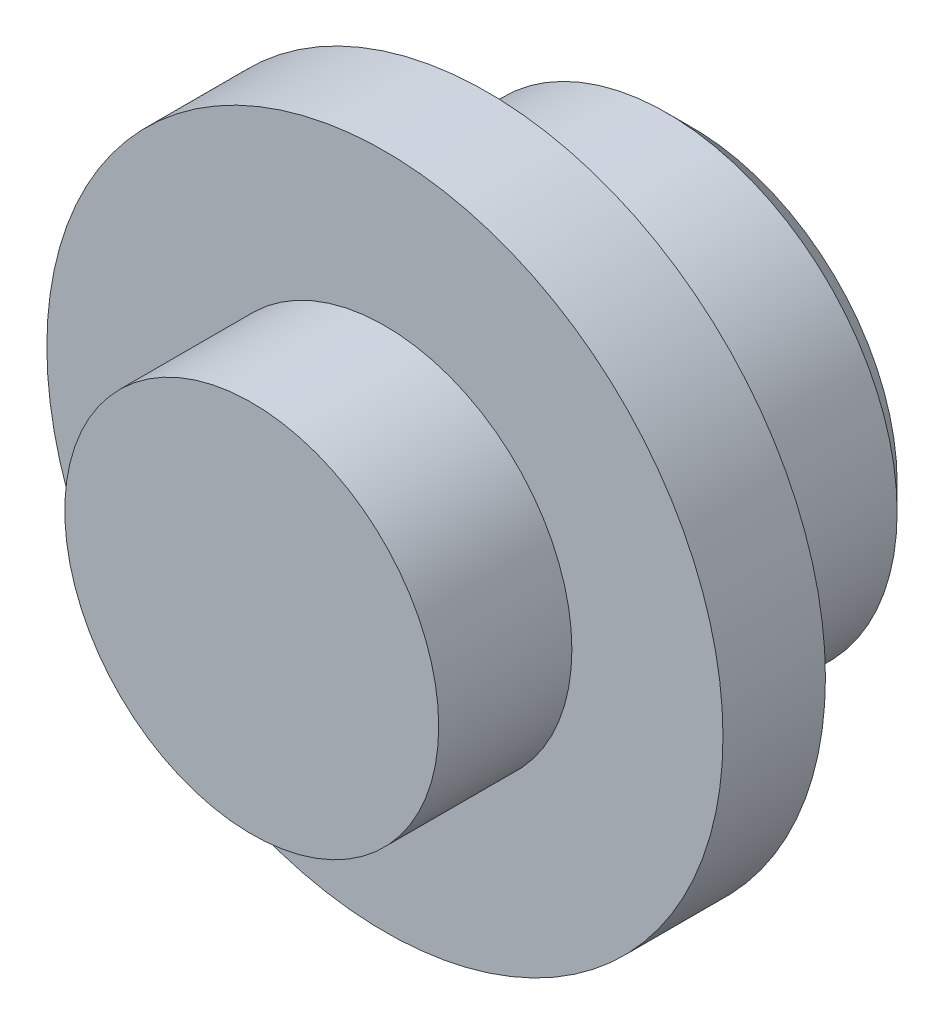
ISO-10303-21;
HEADER;
FILE_DESCRIPTION(('STEP AP214'),'2;1');
FILE_NAME('part.step','',(''),(''),'','','');
FILE_SCHEMA(('AUTOMOTIVE_DESIGN { 1 0 10303 214 1 1 1 1 }'));
ENDSEC;
DATA;
#1=APPLICATION_CONTEXT('core data for automotive mechanical design processes');
#2=APPLICATION_PROTOCOL_DEFINITION('international standard','automotive_design',2000,#1);
#3=PRODUCT_CONTEXT('',#1,'mechanical');
#4=PRODUCT('Part','Part','',(#3));
#5=PRODUCT_RELATED_PRODUCT_CATEGORY('part','',(#4));
#6=PRODUCT_DEFINITION_FORMATION('','',#4);
#7=PRODUCT_DEFINITION_CONTEXT('part definition',#1,'design');
#8=PRODUCT_DEFINITION('design','',#6,#7);
#9=PRODUCT_DEFINITION_SHAPE('','',#8);
#10=(LENGTH_UNIT() NAMED_UNIT(*) SI_UNIT(.MILLI.,.METRE.));
#11=(NAMED_UNIT(*) PLANE_ANGLE_UNIT() SI_UNIT($,.RADIAN.));
#12=(NAMED_UNIT(*) SI_UNIT($,.STERADIAN.) SOLID_ANGLE_UNIT());
#13=UNCERTAINTY_MEASURE_WITH_UNIT(LENGTH_MEASURE(1.E-05),#10,'distance_accuracy_value','');
#14=(GEOMETRIC_REPRESENTATION_CONTEXT(3) GLOBAL_UNCERTAINTY_ASSIGNED_CONTEXT((#13)) GLOBAL_UNIT_ASSIGNED_CONTEXT((#10,
#11,#12)) REPRESENTATION_CONTEXT('',''));
#15=CARTESIAN_POINT('',(0.,0.,0.));
#16=DIRECTION('',(0.,0.,1.));
#17=DIRECTION('',(1.,0.,0.));
#18=AXIS2_PLACEMENT_3D('',#15,#16,#17);
#19=CARTESIAN_POINT('',(-126.049999999161,-3.05000000000037,-10.3338095116624));
#20=DIRECTION('',(0.,0.,1.));
#21=DIRECTION('',(1.,0.,0.));
#22=AXIS2_PLACEMENT_3D('',#19,#20,#21);
#23=CYLINDRICAL_SURFACE('',#22,3.3);
#24=CARTESIAN_POINT('',(-126.049999999161,-3.05000000000037,-1.));
#25=DIRECTION('',(0.,0.,1.));
#26=DIRECTION('',(1.,0.,0.));
#27=AXIS2_PLACEMENT_3D('',#24,#25,#26);
#28=CIRCLE('',#27,3.3);
#29=CARTESIAN_POINT('',(-122.749999999161,-3.05000000000037,-1.));
#30=VERTEX_POINT('',#29);
#31=EDGE_CURVE('E57',#30,#30,#28,.F.);
#32=ORIENTED_EDGE('',*,*,#31,.F.);
#33=EDGE_LOOP('',(#32));
#34=FACE_BOUND('',#33,.T.);
#35=CARTESIAN_POINT('',(-126.049999999161,-3.05000000000037,0.));
#36=DIRECTION('',(0.,0.,1.));
#37=DIRECTION('',(1.,0.,0.));
#38=AXIS2_PLACEMENT_3D('',#35,#36,#37);
#39=CIRCLE('',#38,3.3);
#40=CARTESIAN_POINT('',(-122.749999999161,-3.05000000000037,0.));
#41=VERTEX_POINT('',#40);
#42=EDGE_CURVE('E58',#41,#41,#39,.T.);
#43=ORIENTED_EDGE('',*,*,#42,.F.);
#44=EDGE_LOOP('',(#43));
#45=FACE_BOUND('',#44,.T.);
#46=ADVANCED_FACE('F37',(#34,#45),#23,.T.);
#47=CARTESIAN_POINT('',(-126.049999999161,-3.05000000000037,0.));
#48=DIRECTION('',(0.,0.,1.));
#49=DIRECTION('',(1.,0.,0.));
#50=AXIS2_PLACEMENT_3D('',#47,#48,#49);
#51=PLANE('',#50);
#52=CARTESIAN_POINT('',(-126.049999999161,-3.05000000000037,0.));
#53=DIRECTION('',(0.,0.,1.));
#54=DIRECTION('',(1.,0.,0.));
#55=AXIS2_PLACEMENT_3D('',#52,#53,#54);
#56=CIRCLE('',#55,1.82499999999999);
#57=CARTESIAN_POINT('',(-124.224999999161,-3.05000000000037,0.));
#58=VERTEX_POINT('',#57);
#59=EDGE_CURVE('E10',#58,#58,#56,.T.);
#60=ORIENTED_EDGE('',*,*,#59,.F.);
#61=EDGE_LOOP('',(#60));
#62=FACE_BOUND('',#61,.T.);
#63=ORIENTED_EDGE('',*,*,#42,.T.);
#64=EDGE_LOOP('',(#63));
#65=FACE_BOUND('',#64,.T.);
#66=ADVANCED_FACE('F81',(#62,#65),#51,.T.);
#67=CARTESIAN_POINT('',(-126.049999999161,-3.05000000000037,-1.));
#68=DIRECTION('',(0.,0.,1.));
#69=DIRECTION('',(0.,1.,0.));
#70=AXIS2_PLACEMENT_3D('',#67,#68,#69);
#71=PLANE('',#70);
#72=CARTESIAN_POINT('',(-126.049999999161,-3.05000000000037,-1.));
#73=DIRECTION('',(0.,0.,-1.));
#74=DIRECTION('',(-1.,0.,0.));
#75=AXIS2_PLACEMENT_3D('',#72,#73,#74);
#76=CIRCLE('',#75,2.25000000000001);
#77=CARTESIAN_POINT('',(-128.299999999161,-3.05000000000037,-1.));
#78=VERTEX_POINT('',#77);
#79=EDGE_CURVE('E54',#78,#78,#76,.T.);
#80=ORIENTED_EDGE('',*,*,#79,.F.);
#81=EDGE_LOOP('',(#80));
#82=FACE_BOUND('',#81,.T.);
#83=ORIENTED_EDGE('',*,*,#31,.T.);
#84=EDGE_LOOP('',(#83));
#85=FACE_BOUND('',#84,.T.);
#86=ADVANCED_FACE('F86',(#82,#85),#71,.F.);
#87=CARTESIAN_POINT('',(-126.049999999161,-3.05000000000037,-3.));
#88=DIRECTION('',(0.,0.,1.));
#89=DIRECTION('',(1.,0.,0.));
#90=AXIS2_PLACEMENT_3D('',#87,#88,#89);
#91=CYLINDRICAL_SURFACE('',#90,2.25000000000001);
#92=CARTESIAN_POINT('',(-126.049999999161,-3.05000000000037,-2.75));
#93=DIRECTION('',(0.,0.,-1.));
#94=DIRECTION('',(-1.,0.,0.));
#95=AXIS2_PLACEMENT_3D('',#92,#93,#94);
#96=CIRCLE('',#95,2.25000000000001);
#97=CARTESIAN_POINT('',(-128.299999999161,-3.05000000000037,-2.75));
#98=VERTEX_POINT('',#97);
#99=EDGE_CURVE('E42',#98,#98,#96,.F.);
#100=ORIENTED_EDGE('',*,*,#99,.T.);
#101=EDGE_LOOP('',(#100));
#102=FACE_BOUND('',#101,.T.);
#103=ORIENTED_EDGE('',*,*,#79,.T.);
#104=EDGE_LOOP('',(#103));
#105=FACE_BOUND('',#104,.T.);
#106=ADVANCED_FACE('F77',(#102,#105),#91,.T.);
#107=CARTESIAN_POINT('',(-126.049999999161,-3.05000000000037,-3.));
#108=DIRECTION('',(0.,0.,-1.));
#109=DIRECTION('',(-1.,0.,0.));
#110=AXIS2_PLACEMENT_3D('',#107,#108,#109);
#111=PLANE('',#110);
#112=CARTESIAN_POINT('',(-126.049999999161,-3.05000000000037,-3.));
#113=DIRECTION('',(0.,0.,-1.));
#114=DIRECTION('',(-1.,0.,0.));
#115=AXIS2_PLACEMENT_3D('',#112,#113,#114);
#116=CIRCLE('',#115,2.);
#117=CARTESIAN_POINT('',(-128.049999999161,-3.05000000000037,-3.));
#118=VERTEX_POINT('',#117);
#119=EDGE_CURVE('E50',#118,#118,#116,.T.);
#120=ORIENTED_EDGE('',*,*,#119,.T.);
#121=EDGE_LOOP('',(#120));
#122=FACE_BOUND('',#121,.T.);
#123=ADVANCED_FACE('F65',(#122),#111,.T.);
#124=CARTESIAN_POINT('',(-126.049999999161,-3.05000000000037,-3.));
#125=DIRECTION('',(0.,0.,1.));
#126=DIRECTION('',(1.,0.,0.));
#127=AXIS2_PLACEMENT_3D('',#124,#125,#126);
#128=CONICAL_SURFACE('',#127,2.00000000000002,0.785398163397443);
#129=ORIENTED_EDGE('',*,*,#99,.F.);
#130=EDGE_LOOP('',(#129));
#131=FACE_BOUND('',#130,.T.);
#132=ORIENTED_EDGE('',*,*,#119,.F.);
#133=EDGE_LOOP('',(#132));
#134=FACE_BOUND('',#133,.T.);
#135=ADVANCED_FACE('F40',(#131,#134),#128,.T.);
#136=CARTESIAN_POINT('',(-126.049999999161,-3.05000000000037,1.3));
#137=DIRECTION('',(0.,0.,-1.));
#138=DIRECTION('',(-1.,0.,0.));
#139=AXIS2_PLACEMENT_3D('',#136,#137,#138);
#140=CYLINDRICAL_SURFACE('',#139,1.82499999999999);
#141=CARTESIAN_POINT('',(-126.049999999161,-3.05000000000037,1.3));
#142=DIRECTION('',(0.,0.,1.));
#143=DIRECTION('',(1.,0.,0.));
#144=AXIS2_PLACEMENT_3D('',#141,#142,#143);
#145=CIRCLE('',#144,1.82499999999999);
#146=CARTESIAN_POINT('',(-124.224999999161,-3.05000000000037,1.3));
#147=VERTEX_POINT('',#146);
#148=EDGE_CURVE('E53',#147,#147,#145,.T.);
#149=ORIENTED_EDGE('',*,*,#148,.F.);
#150=EDGE_LOOP('',(#149));
#151=FACE_BOUND('',#150,.T.);
#152=ORIENTED_EDGE('',*,*,#59,.T.);
#153=EDGE_LOOP('',(#152));
#154=FACE_BOUND('',#153,.T.);
#155=ADVANCED_FACE('F68',(#151,#154),#140,.T.);
#156=CARTESIAN_POINT('',(-126.049999999161,-3.05000000000037,1.3));
#157=DIRECTION('',(0.,0.,1.));
#158=DIRECTION('',(1.,0.,0.));
#159=AXIS2_PLACEMENT_3D('',#156,#157,#158);
#160=PLANE('',#159);
#161=ORIENTED_EDGE('',*,*,#148,.T.);
#162=EDGE_LOOP('',(#161));
#163=FACE_BOUND('',#162,.T.);
#164=ADVANCED_FACE('F74',(#163),#160,.T.);
#165=CLOSED_SHELL('',(#46,#66,#86,#106,#123,#135,#155,#164));
#166=MANIFOLD_SOLID_BREP('B2',#165);
#167=ADVANCED_BREP_SHAPE_REPRESENTATION('',(#18,#166),#14);
#168=SHAPE_DEFINITION_REPRESENTATION(#9,#167);
ENDSEC;
END-ISO-10303-21;
